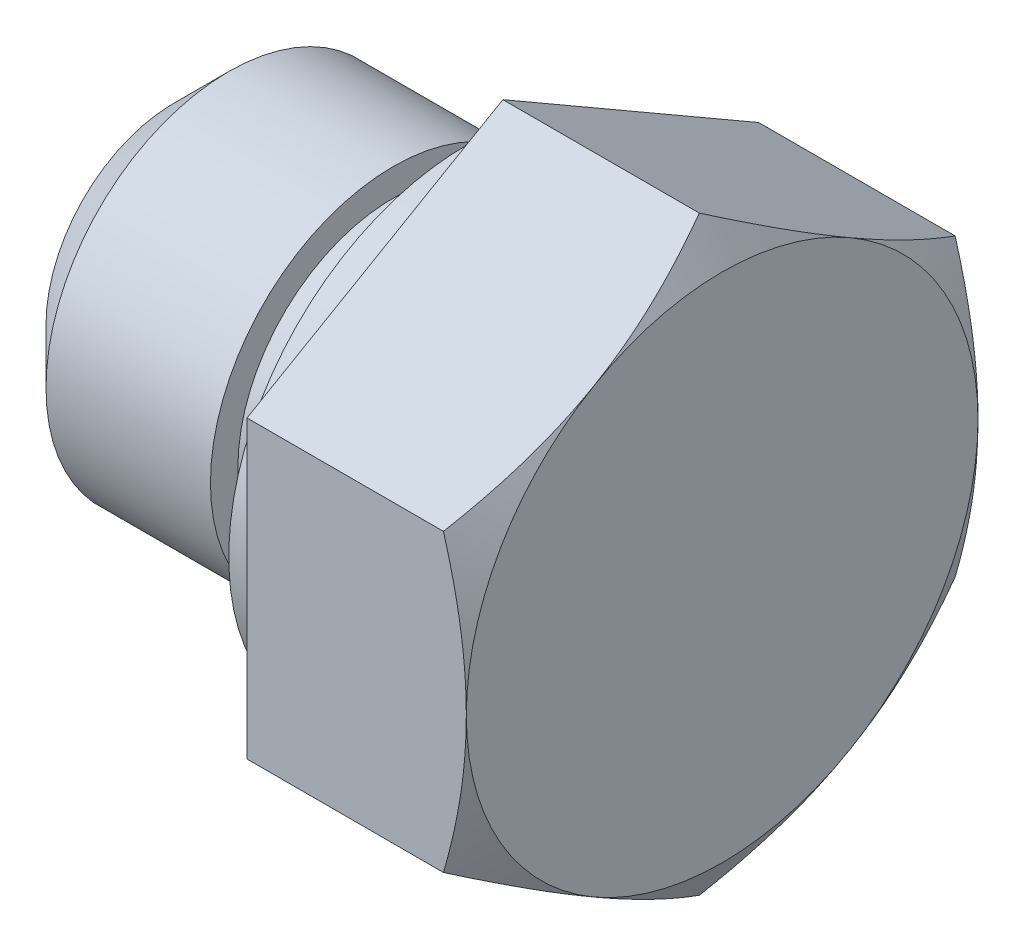
ISO-10303-21;
HEADER;
FILE_DESCRIPTION(('STEP AP214'),'2;1');
FILE_NAME('part.step','',(''),(''),'','','');
FILE_SCHEMA(('AUTOMOTIVE_DESIGN { 1 0 10303 214 1 1 1 1 }'));
ENDSEC;
DATA;
#1=APPLICATION_CONTEXT('core data for automotive mechanical design processes');
#2=APPLICATION_PROTOCOL_DEFINITION('international standard','automotive_design',2000,#1);
#3=PRODUCT_CONTEXT('',#1,'mechanical');
#4=PRODUCT('Part','Part','',(#3));
#5=PRODUCT_RELATED_PRODUCT_CATEGORY('part','',(#4));
#6=PRODUCT_DEFINITION_FORMATION('','',#4);
#7=PRODUCT_DEFINITION_CONTEXT('part definition',#1,'design');
#8=PRODUCT_DEFINITION('design','',#6,#7);
#9=PRODUCT_DEFINITION_SHAPE('','',#8);
#10=(LENGTH_UNIT() NAMED_UNIT(*) SI_UNIT(.MILLI.,.METRE.));
#11=(NAMED_UNIT(*) PLANE_ANGLE_UNIT() SI_UNIT($,.RADIAN.));
#12=(NAMED_UNIT(*) SI_UNIT($,.STERADIAN.) SOLID_ANGLE_UNIT());
#13=UNCERTAINTY_MEASURE_WITH_UNIT(LENGTH_MEASURE(1.E-05),#10,'distance_accuracy_value','');
#14=(GEOMETRIC_REPRESENTATION_CONTEXT(3) GLOBAL_UNCERTAINTY_ASSIGNED_CONTEXT((#13)) GLOBAL_UNIT_ASSIGNED_CONTEXT((#10,
#11,#12)) REPRESENTATION_CONTEXT('',''));
#15=CARTESIAN_POINT('',(0.,0.,0.));
#16=DIRECTION('',(0.,0.,1.));
#17=DIRECTION('',(1.,0.,0.));
#18=AXIS2_PLACEMENT_3D('',#15,#16,#17);
#19=CARTESIAN_POINT('',(-6.,8.08290376865473,0.));
#20=DIRECTION('',(0.,0.86602540378444,0.499999999999998));
#21=DIRECTION('',(0.,-0.499999999999998,0.86602540378444));
#22=AXIS2_PLACEMENT_3D('',#19,#20,#21);
#23=PLANE('',#22);
#24=CARTESIAN_POINT('',(-0.62528145043448,8.08301923870857,-0.000200000000000037));
#25=CARTESIAN_POINT('',(-0.573999847053467,7.99418356332249,0.153667903293392));
#26=CARTESIAN_POINT('',(-0.525045594003568,7.90501666556986,0.30810950055425));
#27=CARTESIAN_POINT('',(-0.432432787270118,7.72595873929903,0.618246926353253));
#28=CARTESIAN_POINT('',(-0.388776518079346,7.63606741609893,0.773943265295414));
#29=CARTESIAN_POINT('',(-0.26661159217948,7.36495417725223,1.24352516958246));
#30=CARTESIAN_POINT('',(-0.197125556894938,7.18266208641079,1.5592643327378));
#31=CARTESIAN_POINT('',(-0.115644956399085,6.90986528970959,2.03176224476632));
#32=CARTESIAN_POINT('',(-0.0924334848814621,6.82017566928257,2.18710922425748));
#33=CARTESIAN_POINT('',(-0.0535112144324508,6.64039116946079,2.49850511236216));
#34=CARTESIAN_POINT('',(-0.037799752779519,6.55029632658302,2.6545539577264));
#35=CARTESIAN_POINT('',(-0.0142779132830506,6.3699501664105,2.96692267009517));
#36=CARTESIAN_POINT('',(-0.00645856866285571,6.27969914366235,3.12324202693));
#37=CARTESIAN_POINT('',(0.00111975822770119,6.09911871281641,3.43601650800787));
#38=CARTESIAN_POINT('',(0.000878989506020932,6.00878930722636,3.59247162790733));
#39=CARTESIAN_POINT('',(-0.0108597318155942,5.7613166335591,4.02110687218393));
#40=CARTESIAN_POINT('',(-0.0305657427429098,5.60425437562032,4.29314668288539));
#41=CARTESIAN_POINT('',(-0.0930534601257633,5.29117305327855,4.83541944008219));
#42=CARTESIAN_POINT('',(-0.135856524112979,5.13515508991673,5.10565047951828));
#43=CARTESIAN_POINT('',(-0.242851679710355,4.82144370220968,5.64901454193983));
#44=CARTESIAN_POINT('',(-0.307497094569662,4.66378986193159,5.92207900330984));
#45=CARTESIAN_POINT('',(-0.454216071847031,4.35083323311212,6.46413578499063));
#46=CARTESIAN_POINT('',(-0.536255171025556,4.19552643669177,6.73313504715144));
#47=CARTESIAN_POINT('',(-0.625281450434493,4.04133641427354,7.0002));
#48=B_SPLINE_CURVE_WITH_KNOTS('',3,(#24,#25,#26,#27,#28,#29,#30,#31,#32,#33,#34,#35,#36,#37,#38,
#39,#40,#41,#42,#43,#44,#45,#46,#47),.UNSPECIFIED.,.F.,.F.,(4,2,2,2,2,2,2,2,2,2,2,4),(0.,
0.554727910214693,1.10969417576209,2.22193274027189,2.76443041023616,3.30688013473356,
3.84871284867108,4.39052882332377,5.33376515141417,6.27787517570455,7.24292418883238,
8.20607866430096),.UNSPECIFIED.);
#49=CARTESIAN_POINT('',(-0.625214782339262,8.08290376865473,0.));
#50=VERTEX_POINT('',#49);
#51=CARTESIAN_POINT('',(0.,6.06217782649108,3.49999999999999));
#52=VERTEX_POINT('',#51);
#53=EDGE_CURVE('E241',#50,#52,#48,.T.);
#54=ORIENTED_EDGE('',*,*,#53,.F.);
#55=DIRECTION('',(1.,0.,0.));
#56=VECTOR('',#55,1.);
#57=CARTESIAN_POINT('',(-6.,8.08290376865473,0.));
#58=LINE('',#57,#56);
#59=CARTESIAN_POINT('',(-6.,8.08290376865473,0.));
#60=VERTEX_POINT('',#59);
#61=EDGE_CURVE('E148',#60,#50,#58,.T.);
#62=ORIENTED_EDGE('',*,*,#61,.F.);
#63=DIRECTION('',(0.,-0.499999999999998,0.86602540378444));
#64=VECTOR('',#63,1.);
#65=CARTESIAN_POINT('',(-6.,8.08290376865473,0.));
#66=LINE('',#65,#64);
#67=CARTESIAN_POINT('',(-6.,4.04145188432738,7.));
#68=VERTEX_POINT('',#67);
#69=EDGE_CURVE('E325',#60,#68,#66,.T.);
#70=ORIENTED_EDGE('',*,*,#69,.T.);
#71=DIRECTION('',(1.,0.,0.));
#72=VECTOR('',#71,1.);
#73=CARTESIAN_POINT('',(-6.,4.04145188432738,7.));
#74=LINE('',#73,#72);
#75=CARTESIAN_POINT('',(-0.625214782339276,4.04145188432738,7.));
#76=VERTEX_POINT('',#75);
#77=EDGE_CURVE('E271',#68,#76,#74,.T.);
#78=ORIENTED_EDGE('',*,*,#77,.T.);
#79=EDGE_CURVE('E207',#52,#76,#48,.T.);
#80=ORIENTED_EDGE('',*,*,#79,.F.);
#81=EDGE_LOOP('',(#54,#62,#70,#78,#80));
#82=FACE_BOUND('',#81,.T.);
#83=ADVANCED_FACE('F49',(#82),#23,.T.);
#84=CARTESIAN_POINT('',(-6.,8.08290376865473,0.));
#85=DIRECTION('',(0.,0.86602540378444,-0.499999999999998));
#86=DIRECTION('',(0.,0.499999999999998,0.86602540378444));
#87=AXIS2_PLACEMENT_3D('',#84,#85,#86);
#88=PLANE('',#87);
#89=CARTESIAN_POINT('',(-0.625281450434494,4.04133641427354,-7.0002));
#90=CARTESIAN_POINT('',(-0.57399984705348,4.13017208965962,-6.84633209670661));
#91=CARTESIAN_POINT('',(-0.52504559400358,4.21933898741225,-6.69189049944575));
#92=CARTESIAN_POINT('',(-0.432432787270129,4.39839691368308,-6.38175307364675));
#93=CARTESIAN_POINT('',(-0.388776518079356,4.48828823688318,-6.22605673470458));
#94=CARTESIAN_POINT('',(-0.266611592179489,4.75940147572988,-5.75647483041754));
#95=CARTESIAN_POINT('',(-0.197125556894946,4.94169356657132,-5.4407356672622));
#96=CARTESIAN_POINT('',(-0.115644956399091,5.21449036327253,-4.96823775523367));
#97=CARTESIAN_POINT('',(-0.0924334848814674,5.30417998369954,-4.81289077574251));
#98=CARTESIAN_POINT('',(-0.0535112144324548,5.48396448352132,-4.50149488763784));
#99=CARTESIAN_POINT('',(-0.0377997527795224,5.5740593263991,-4.34544604227359));
#100=CARTESIAN_POINT('',(-0.0142779132830528,5.75440548657162,-4.03307732990483));
#101=CARTESIAN_POINT('',(-0.00645856866285735,5.84465650931976,-3.87675797306999));
#102=CARTESIAN_POINT('',(0.00111975822770057,6.02523694016571,-3.56398349199213));
#103=CARTESIAN_POINT('',(0.000878989506020807,6.11556634575576,-3.40752837209266));
#104=CARTESIAN_POINT('',(-0.0108597318155929,6.36303901942301,-2.97889312781607));
#105=CARTESIAN_POINT('',(-0.0305657427429074,6.5201012773618,-2.7068533171146));
#106=CARTESIAN_POINT('',(-0.0930534601257584,6.83318259970356,-2.16458055991781));
#107=CARTESIAN_POINT('',(-0.135856524112973,6.98920056306538,-1.89434952048172));
#108=CARTESIAN_POINT('',(-0.242851679710346,7.30291195077243,-1.35098545806017));
#109=CARTESIAN_POINT('',(-0.307497094569652,7.46056579105052,-1.07792099669016));
#110=CARTESIAN_POINT('',(-0.45421607184702,7.77352241986999,-0.535864215009371));
#111=CARTESIAN_POINT('',(-0.536255171025544,7.92882921629034,-0.26686495284856));
#112=CARTESIAN_POINT('',(-0.62528145043448,8.08301923870857,0.000199999999999549));
#113=B_SPLINE_CURVE_WITH_KNOTS('',3,(#89,#90,#91,#92,#93,#94,#95,#96,#97,#98,#99,#100,#101,#102,
#103,#104,#105,#106,#107,#108,#109,#110,#111,#112),.UNSPECIFIED.,.F.,.F.,(4,2,2,2,2,2,2,2,2,2,2,
4),(0.,0.554727910214693,1.10969417576209,2.2219327402719,2.76443041023617,3.30688013473357,
3.84871284867109,4.39052882332378,5.33376515141418,6.27787517570455,7.24292418883239,
8.20607866430096),.UNSPECIFIED.);
#114=CARTESIAN_POINT('',(-0.625214782339275,4.04145188432738,-7.));
#115=VERTEX_POINT('',#114);
#116=CARTESIAN_POINT('',(0.,6.06217782649108,-3.49999999999999));
#117=VERTEX_POINT('',#116);
#118=EDGE_CURVE('E142',#115,#117,#113,.T.);
#119=ORIENTED_EDGE('',*,*,#118,.F.);
#120=DIRECTION('',(1.,0.,0.));
#121=VECTOR('',#120,1.);
#122=CARTESIAN_POINT('',(-6.,4.04145188432738,-7.));
#123=LINE('',#122,#121);
#124=CARTESIAN_POINT('',(-6.,4.04145188432738,-7.));
#125=VERTEX_POINT('',#124);
#126=EDGE_CURVE('E157',#125,#115,#123,.T.);
#127=ORIENTED_EDGE('',*,*,#126,.F.);
#128=DIRECTION('',(0.,0.499999999999998,0.86602540378444));
#129=VECTOR('',#128,1.);
#130=CARTESIAN_POINT('',(-6.,8.08290376865473,0.));
#131=LINE('',#130,#129);
#132=EDGE_CURVE('E251',#125,#60,#131,.T.);
#133=ORIENTED_EDGE('',*,*,#132,.T.);
#134=ORIENTED_EDGE('',*,*,#61,.T.);
#135=EDGE_CURVE('E170',#117,#50,#113,.T.);
#136=ORIENTED_EDGE('',*,*,#135,.F.);
#137=EDGE_LOOP('',(#119,#127,#133,#134,#136));
#138=FACE_BOUND('',#137,.T.);
#139=ADVANCED_FACE('F233',(#138),#88,.T.);
#140=CARTESIAN_POINT('',(-6.,4.04145188432738,-7.));
#141=DIRECTION('',(0.,0.,-1.));
#142=DIRECTION('',(-1.,0.,0.));
#143=AXIS2_PLACEMENT_3D('',#140,#141,#142);
#144=PLANE('',#143);
#145=CARTESIAN_POINT('',(-3.40647718411653,-10.8358175614818,-7.));
#146=CARTESIAN_POINT('',(-3.25833232592636,-10.5302545485942,-7.));
#147=CARTESIAN_POINT('',(-3.111613720942,-10.22398795681,-7.));
#148=CARTESIAN_POINT('',(-2.8218315559376,-9.60967337631041,-7.));
#149=CARTESIAN_POINT('',(-2.67876857590034,-9.30162511431575,-7.));
#150=CARTESIAN_POINT('',(-2.39637614188585,-8.68177612024009,-7.));
#151=CARTESIAN_POINT('',(-2.25707143091345,-8.369964076357,-7.));
#152=CARTESIAN_POINT('',(-1.98418944123837,-7.74385304690142,-7.));
#153=CARTESIAN_POINT('',(-1.85061189059808,-7.42955418024978,-7.));
#154=CARTESIAN_POINT('',(-1.5865489113585,-6.78788985792206,-7.));
#155=CARTESIAN_POINT('',(-1.45629797244,-6.46042736430258,-7.));
#156=CARTESIAN_POINT('',(-1.20570248792891,-5.80166465463294,-7.));
#157=CARTESIAN_POINT('',(-1.08535905701311,-5.47036401152937,-7.));
#158=CARTESIAN_POINT('',(-0.857752966677389,-4.80402056190686,-7.));
#159=CARTESIAN_POINT('',(-0.750463650885666,-4.46898695982013,-7.));
#160=CARTESIAN_POINT('',(-0.552420339868015,-3.79412598937883,-7.));
#161=CARTESIAN_POINT('',(-0.461661115004447,-3.45430017392697,-7.));
#162=CARTESIAN_POINT('',(-0.301536117966153,-2.77149411096548,-7.));
#163=CARTESIAN_POINT('',(-0.232054703144718,-2.42854173774751,-7.));
#164=CARTESIAN_POINT('',(-0.146807505198832,-1.91100613781136,-7.));
#165=CARTESIAN_POINT('',(-0.121553095797278,-1.73796353772253,-7.));
#166=CARTESIAN_POINT('',(-0.0778650636704582,-1.39102504773377,-7.));
#167=CARTESIAN_POINT('',(-0.0594307828007719,-1.21712924181031,-7.));
#168=CARTESIAN_POINT('',(-0.0299803976593833,-0.870979918063503,-7.));
#169=CARTESIAN_POINT('',(-0.0188711794294456,-0.698734353184645,-7.));
#170=CARTESIAN_POINT('',(-0.0039452094440766,-0.353927898728433,-7.));
#171=CARTESIAN_POINT('',(-0.000128337398342371,-0.181367014399407,-7.));
#172=CARTESIAN_POINT('',(0.000121946393858136,0.163761692880148,-7.));
#173=CARTESIAN_POINT('',(-0.00344466509431518,0.336329515850802,-7.));
#174=CARTESIAN_POINT('',(-0.0178745205028026,0.681162045989254,-7.));
#175=CARTESIAN_POINT('',(-0.0287381329546606,0.853426737406946,-7.));
#176=CARTESIAN_POINT('',(-0.0634383247106036,1.26805025785209,-7.));
#177=CARTESIAN_POINT('',(-0.0907714800226244,1.510122562681,-7.));
#178=CARTESIAN_POINT('',(-0.158351025934006,1.99244585805923,-7.));
#179=CARTESIAN_POINT('',(-0.198599189902024,2.23269659384754,-7.));
#180=CARTESIAN_POINT('',(-0.336579908016218,2.95045642573076,-7.));
#181=CARTESIAN_POINT('',(-0.451522772534744,3.42469944208484,-7.));
#182=CARTESIAN_POINT('',(-0.650530681178876,4.13376993160629,-7.));
#183=CARTESIAN_POINT('',(-0.722214608399906,4.37228357513026,-7.));
#184=CARTESIAN_POINT('',(-0.872950919031528,4.84699383147595,-7.));
#185=CARTESIAN_POINT('',(-0.952003350296226,5.08319042923882,-7.));
#186=CARTESIAN_POINT('',(-1.11621474174076,5.553342141651,-7.));
#187=CARTESIAN_POINT('',(-1.20137163469723,5.78729798497222,-7.));
#188=CARTESIAN_POINT('',(-1.37679770503713,6.25327673008516,-7.));
#189=CARTESIAN_POINT('',(-1.46706682796128,6.48529965243761,-7.));
#190=CARTESIAN_POINT('',(-1.68245779004258,7.02415714408479,-7.));
#191=CARTESIAN_POINT('',(-1.80922552668017,7.33033251498721,-7.));
#192=CARTESIAN_POINT('',(-2.0687439690465,7.94014448268288,-7.));
#193=CARTESIAN_POINT('',(-2.20149501258295,8.24378093498271,-7.));
#194=CARTESIAN_POINT('',(-2.47180399778318,8.84896980958857,-7.));
#195=CARTESIAN_POINT('',(-2.60936284290799,9.15052182730572,-7.));
#196=CARTESIAN_POINT('',(-2.88834600983433,9.75183563193705,-7.));
#197=CARTESIAN_POINT('',(-3.0297704106953,10.0515973820831,-7.));
#198=CARTESIAN_POINT('',(-3.31591619771848,10.6499161094925,-7.));
#199=CARTESIAN_POINT('',(-3.4606407974656,10.9484715473446,-7.));
#200=CARTESIAN_POINT('',(-3.75269710193324,11.54430568228,-7.));
#201=CARTESIAN_POINT('',(-3.90002882942621,11.841584368183,-7.));
#202=CARTESIAN_POINT('',(-4.34521692262862,12.7317300689053,-7.));
#203=CARTESIAN_POINT('',(-4.64630246567392,13.322981950543,-7.));
#204=CARTESIAN_POINT('',(-5.22977516914347,14.4542671873634,-7.));
#205=CARTESIAN_POINT('',(-5.51168611592301,14.9945472434059,-7.));
#206=CARTESIAN_POINT('',(-6.07939885473634,16.0730805827809,-7.));
#207=CARTESIAN_POINT('',(-6.36520077518348,16.6113337984698,-7.));
#208=CARTESIAN_POINT('',(-6.93908880001351,17.684965085016,-7.));
#209=CARTESIAN_POINT('',(-7.22716781213951,18.2203469529571,-7.));
#210=CARTESIAN_POINT('',(-7.80566492511165,19.2898093080473,-7.));
#211=CARTESIAN_POINT('',(-8.09608290102679,19.8238898627446,-7.));
#212=CARTESIAN_POINT('',(-8.38737690869703,20.3574889291127,-7.));
#213=B_SPLINE_CURVE_WITH_KNOTS('',3,(#145,#146,#147,#148,#149,#150,#151,#152,#153,#154,#155,
#156,#157,#158,#159,#160,#161,#162,#163,#164,#165,#166,#167,#168,#169,#170,#171,#172,#173,#174,
#175,#176,#177,#178,#179,#180,#181,#182,#183,#184,#185,#186,#187,#188,#189,#190,#191,#192,#193,
#194,#195,#196,#197,#198,#199,#200,#201,#202,#203,#204,#205,#206,#207,#208,#209,#210,#211,#212),
.UNSPECIFIED.,.F.,.F.,(4,2,2,2,2,2,2,2,2,2,2,2,2,2,2,2,2,2,2,2,2,2,2,2,2,2,2,2,2,2,2,2,2,4),(0.,
1.018757293027,2.03767522574771,3.06217433841088,4.08662475170767,5.14374817644501,
6.20099037425493,7.25603611173218,8.31074748156437,9.35962048565461,9.88413446093951,
10.4085978072602,10.9262587703404,11.4439111943126,11.9615652472565,12.4792454460368,
13.209663902144,13.9401826954563,15.402041371645,16.1491386849674,16.8962408505862,
17.6430912009049,18.3899335967139,19.3839921065503,20.3781068097794,21.3724093378441,
22.3667322169071,23.3620685775059,24.3574136363543,26.347853251912,28.1760558969848,
30.0043190249841,31.8282123395925,33.6520088723316),.UNSPECIFIED.);
#214=CARTESIAN_POINT('',(-0.625214782339276,-4.04145188432738,-7.));
#215=VERTEX_POINT('',#214);
#216=CARTESIAN_POINT('',(0.,0.,-7.));
#217=VERTEX_POINT('',#216);
#218=EDGE_CURVE('E121',#215,#217,#213,.T.);
#219=ORIENTED_EDGE('',*,*,#218,.F.);
#220=DIRECTION('',(1.,0.,0.));
#221=VECTOR('',#220,1.);
#222=CARTESIAN_POINT('',(-6.,-4.04145188432738,-7.));
#223=LINE('',#222,#221);
#224=CARTESIAN_POINT('',(-6.,-4.04145188432738,-7.));
#225=VERTEX_POINT('',#224);
#226=EDGE_CURVE('E256',#225,#215,#223,.T.);
#227=ORIENTED_EDGE('',*,*,#226,.F.);
#228=DIRECTION('',(0.,1.,0.));
#229=VECTOR('',#228,1.);
#230=CARTESIAN_POINT('',(-6.,4.04145188432738,-7.));
#231=LINE('',#230,#229);
#232=EDGE_CURVE('E347',#225,#125,#231,.T.);
#233=ORIENTED_EDGE('',*,*,#232,.T.);
#234=ORIENTED_EDGE('',*,*,#126,.T.);
#235=EDGE_CURVE('E134',#217,#115,#213,.T.);
#236=ORIENTED_EDGE('',*,*,#235,.F.);
#237=EDGE_LOOP('',(#219,#227,#233,#234,#236));
#238=FACE_BOUND('',#237,.T.);
#239=ADVANCED_FACE('F155',(#238),#144,.T.);
#240=CARTESIAN_POINT('',(-6.,-4.04145188432738,-7.));
#241=DIRECTION('',(0.,-0.86602540378444,-0.499999999999998));
#242=DIRECTION('',(0.,0.499999999999998,-0.86602540378444));
#243=AXIS2_PLACEMENT_3D('',#240,#241,#242);
#244=PLANE('',#243);
#245=CARTESIAN_POINT('',(-0.62528145043448,-8.08301923870857,0.0002));
#246=CARTESIAN_POINT('',(-0.573999847053467,-7.99418356332249,-0.153667903293392));
#247=CARTESIAN_POINT('',(-0.525045594003568,-7.90501666556986,-0.30810950055425));
#248=CARTESIAN_POINT('',(-0.432432787270118,-7.72595873929903,-0.618246926353253));
#249=CARTESIAN_POINT('',(-0.388776518079346,-7.63606741609893,-0.773943265295414));
#250=CARTESIAN_POINT('',(-0.26661159217948,-7.36495417725223,-1.24352516958246));
#251=CARTESIAN_POINT('',(-0.197125556894938,-7.18266208641079,-1.5592643327378));
#252=CARTESIAN_POINT('',(-0.115644956399085,-6.90986528970959,-2.03176224476633));
#253=CARTESIAN_POINT('',(-0.092433484881462,-6.82017566928257,-2.18710922425748));
#254=CARTESIAN_POINT('',(-0.0535112144324507,-6.64039116946079,-2.49850511236216));
#255=CARTESIAN_POINT('',(-0.037799752779519,-6.55029632658302,-2.6545539577264));
#256=CARTESIAN_POINT('',(-0.0142779132830507,-6.3699501664105,-2.96692267009517));
#257=CARTESIAN_POINT('',(-0.00645856866285586,-6.27969914366236,-3.12324202693));
#258=CARTESIAN_POINT('',(0.00111975822770083,-6.09911871281641,-3.43601650800787));
#259=CARTESIAN_POINT('',(0.000878989506020452,-6.00878930722636,-3.59247162790733));
#260=CARTESIAN_POINT('',(-0.0108597318155948,-5.7613166335591,-4.02110687218393));
#261=CARTESIAN_POINT('',(-0.0305657427429101,-5.60425437562032,-4.29314668288539));
#262=CARTESIAN_POINT('',(-0.0930534601257633,-5.29117305327855,-4.83541944008219));
#263=CARTESIAN_POINT('',(-0.135856524112979,-5.13515508991673,-5.10565047951827));
#264=CARTESIAN_POINT('',(-0.242851679710355,-4.82144370220968,-5.64901454193983));
#265=CARTESIAN_POINT('',(-0.307497094569662,-4.66378986193159,-5.92207900330984));
#266=CARTESIAN_POINT('',(-0.454216071847032,-4.35083323311212,-6.46413578499063));
#267=CARTESIAN_POINT('',(-0.536255171025556,-4.19552643669177,-6.73313504715144));
#268=CARTESIAN_POINT('',(-0.625281450434493,-4.04133641427354,-7.0002));
#269=B_SPLINE_CURVE_WITH_KNOTS('',3,(#245,#246,#247,#248,#249,#250,#251,#252,#253,#254,#255,
#256,#257,#258,#259,#260,#261,#262,#263,#264,#265,#266,#267,#268),.UNSPECIFIED.,.F.,.F.,(4,2,2,
2,2,2,2,2,2,2,2,4),(0.,0.554727910214691,1.10969417576209,2.22193274027189,2.76443041023616,
3.30688013473356,3.84871284867108,4.39052882332377,5.33376515141417,6.27787517570455,
7.24292418883238,8.20607866430096),.UNSPECIFIED.);
#270=CARTESIAN_POINT('',(-0.625214782339262,-8.08290376865473,0.));
#271=VERTEX_POINT('',#270);
#272=CARTESIAN_POINT('',(0.,-6.06217782649108,-3.49999999999999));
#273=VERTEX_POINT('',#272);
#274=EDGE_CURVE('E65',#271,#273,#269,.T.);
#275=ORIENTED_EDGE('',*,*,#274,.F.);
#276=DIRECTION('',(1.,0.,0.));
#277=VECTOR('',#276,1.);
#278=CARTESIAN_POINT('',(-6.,-8.08290376865473,0.));
#279=LINE('',#278,#277);
#280=CARTESIAN_POINT('',(-6.,-8.08290376865473,0.));
#281=VERTEX_POINT('',#280);
#282=EDGE_CURVE('E263',#281,#271,#279,.T.);
#283=ORIENTED_EDGE('',*,*,#282,.F.);
#284=DIRECTION('',(0.,0.499999999999998,-0.86602540378444));
#285=VECTOR('',#284,1.);
#286=CARTESIAN_POINT('',(-6.,-4.04145188432738,-7.));
#287=LINE('',#286,#285);
#288=EDGE_CURVE('E344',#281,#225,#287,.T.);
#289=ORIENTED_EDGE('',*,*,#288,.T.);
#290=ORIENTED_EDGE('',*,*,#226,.T.);
#291=EDGE_CURVE('E128',#273,#215,#269,.T.);
#292=ORIENTED_EDGE('',*,*,#291,.F.);
#293=EDGE_LOOP('',(#275,#283,#289,#290,#292));
#294=FACE_BOUND('',#293,.T.);
#295=ADVANCED_FACE('F218',(#294),#244,.T.);
#296=CARTESIAN_POINT('',(-6.,-4.04145188432738,7.));
#297=DIRECTION('',(0.,-0.86602540378444,0.499999999999998));
#298=DIRECTION('',(0.,-0.499999999999998,-0.86602540378444));
#299=AXIS2_PLACEMENT_3D('',#296,#297,#298);
#300=PLANE('',#299);
#301=CARTESIAN_POINT('',(-0.625281450434494,-4.04133641427354,7.0002));
#302=CARTESIAN_POINT('',(-0.57399984705348,-4.13017208965962,6.84633209670661));
#303=CARTESIAN_POINT('',(-0.52504559400358,-4.21933898741225,6.69189049944575));
#304=CARTESIAN_POINT('',(-0.432432787270129,-4.39839691368308,6.38175307364674));
#305=CARTESIAN_POINT('',(-0.388776518079356,-4.48828823688318,6.22605673470458));
#306=CARTESIAN_POINT('',(-0.266611592179489,-4.75940147572988,5.75647483041753));
#307=CARTESIAN_POINT('',(-0.197125556894946,-4.94169356657132,5.4407356672622));
#308=CARTESIAN_POINT('',(-0.115644956399091,-5.21449036327253,4.96823775523367));
#309=CARTESIAN_POINT('',(-0.0924334848814675,-5.30417998369954,4.81289077574251));
#310=CARTESIAN_POINT('',(-0.0535112144324547,-5.48396448352132,4.50149488763784));
#311=CARTESIAN_POINT('',(-0.037799752779522,-5.5740593263991,4.34544604227359));
#312=CARTESIAN_POINT('',(-0.0142779132830524,-5.75440548657162,4.03307732990483));
#313=CARTESIAN_POINT('',(-0.00645856866285739,-5.84465650931976,3.87675797306999));
#314=CARTESIAN_POINT('',(0.00111975822770036,-6.02523694016571,3.56398349199213));
#315=CARTESIAN_POINT('',(0.000878989506020792,-6.11556634575576,3.40752837209266));
#316=CARTESIAN_POINT('',(-0.0108597318155926,-6.36303901942301,2.97889312781607));
#317=CARTESIAN_POINT('',(-0.030565742742907,-6.5201012773618,2.7068533171146));
#318=CARTESIAN_POINT('',(-0.0930534601257582,-6.83318259970356,2.16458055991781));
#319=CARTESIAN_POINT('',(-0.135856524112973,-6.98920056306538,1.89434952048172));
#320=CARTESIAN_POINT('',(-0.242851679710346,-7.30291195077243,1.35098545806017));
#321=CARTESIAN_POINT('',(-0.307497094569652,-7.46056579105052,1.07792099669016));
#322=CARTESIAN_POINT('',(-0.45421607184702,-7.77352241986999,0.535864215009371));
#323=CARTESIAN_POINT('',(-0.536255171025543,-7.92882921629034,0.26686495284856));
#324=CARTESIAN_POINT('',(-0.62528145043448,-8.08301923870857,-0.000200000000000001));
#325=B_SPLINE_CURVE_WITH_KNOTS('',3,(#301,#302,#303,#304,#305,#306,#307,#308,#309,#310,#311,
#312,#313,#314,#315,#316,#317,#318,#319,#320,#321,#322,#323,#324),.UNSPECIFIED.,.F.,.F.,(4,2,2,
2,2,2,2,2,2,2,2,4),(0.,0.554727910214694,1.10969417576209,2.2219327402719,2.76443041023617,
3.30688013473357,3.84871284867109,4.39052882332378,5.33376515141418,6.27787517570455,
7.24292418883239,8.20607866430096),.UNSPECIFIED.);
#326=CARTESIAN_POINT('',(-0.625214782339275,-4.04145188432738,7.));
#327=VERTEX_POINT('',#326);
#328=CARTESIAN_POINT('',(0.,-6.06217782649108,3.49999999999999));
#329=VERTEX_POINT('',#328);
#330=EDGE_CURVE('E73',#327,#329,#325,.T.);
#331=ORIENTED_EDGE('',*,*,#330,.F.);
#332=DIRECTION('',(1.,0.,0.));
#333=VECTOR('',#332,1.);
#334=CARTESIAN_POINT('',(-6.,-4.04145188432738,7.));
#335=LINE('',#334,#333);
#336=CARTESIAN_POINT('',(-6.,-4.04145188432738,7.));
#337=VERTEX_POINT('',#336);
#338=EDGE_CURVE('E267',#337,#327,#335,.T.);
#339=ORIENTED_EDGE('',*,*,#338,.F.);
#340=DIRECTION('',(0.,-0.499999999999998,-0.86602540378444));
#341=VECTOR('',#340,1.);
#342=CARTESIAN_POINT('',(-6.,-4.04145188432738,7.));
#343=LINE('',#342,#341);
#344=EDGE_CURVE('E335',#337,#281,#343,.T.);
#345=ORIENTED_EDGE('',*,*,#344,.T.);
#346=ORIENTED_EDGE('',*,*,#282,.T.);
#347=EDGE_CURVE('E217',#329,#271,#325,.T.);
#348=ORIENTED_EDGE('',*,*,#347,.F.);
#349=EDGE_LOOP('',(#331,#339,#345,#346,#348));
#350=FACE_BOUND('',#349,.T.);
#351=ADVANCED_FACE('F221',(#350),#300,.T.);
#352=CARTESIAN_POINT('',(-6.,4.04145188432738,7.));
#353=DIRECTION('',(0.,0.,1.));
#354=DIRECTION('',(1.,0.,0.));
#355=AXIS2_PLACEMENT_3D('',#352,#353,#354);
#356=PLANE('',#355);
#357=CARTESIAN_POINT('',(-3.40647718411653,-10.8358175614818,7.));
#358=CARTESIAN_POINT('',(-3.25833232592636,-10.5302545485942,7.));
#359=CARTESIAN_POINT('',(-3.111613720942,-10.22398795681,7.));
#360=CARTESIAN_POINT('',(-2.8218315559376,-9.60967337631041,7.));
#361=CARTESIAN_POINT('',(-2.67876857590034,-9.30162511431575,7.));
#362=CARTESIAN_POINT('',(-2.39637614188585,-8.68177612024009,7.));
#363=CARTESIAN_POINT('',(-2.25707143091345,-8.369964076357,7.));
#364=CARTESIAN_POINT('',(-1.98418944123837,-7.74385304690142,7.));
#365=CARTESIAN_POINT('',(-1.85061189059808,-7.42955418024978,7.));
#366=CARTESIAN_POINT('',(-1.5865489113585,-6.78788985792206,7.));
#367=CARTESIAN_POINT('',(-1.45629797244,-6.46042736430258,7.));
#368=CARTESIAN_POINT('',(-1.20570248792891,-5.80166465463294,7.));
#369=CARTESIAN_POINT('',(-1.08535905701311,-5.47036401152937,7.));
#370=CARTESIAN_POINT('',(-0.857752966677389,-4.80402056190686,7.));
#371=CARTESIAN_POINT('',(-0.750463650885666,-4.46898695982013,7.));
#372=CARTESIAN_POINT('',(-0.552420339868015,-3.79412598937883,7.));
#373=CARTESIAN_POINT('',(-0.461661115004447,-3.45430017392697,7.));
#374=CARTESIAN_POINT('',(-0.301536117966153,-2.77149411096548,7.));
#375=CARTESIAN_POINT('',(-0.232054703144718,-2.42854173774751,7.));
#376=CARTESIAN_POINT('',(-0.146807505198832,-1.91100613781136,7.));
#377=CARTESIAN_POINT('',(-0.121553095797278,-1.73796353772253,7.));
#378=CARTESIAN_POINT('',(-0.0778650636704582,-1.39102504773377,7.));
#379=CARTESIAN_POINT('',(-0.0594307828007719,-1.21712924181031,7.));
#380=CARTESIAN_POINT('',(-0.0299803976593833,-0.870979918063503,7.));
#381=CARTESIAN_POINT('',(-0.0188711794294456,-0.698734353184645,7.));
#382=CARTESIAN_POINT('',(-0.0039452094440766,-0.353927898728433,7.));
#383=CARTESIAN_POINT('',(-0.000128337398342371,-0.181367014399407,7.));
#384=CARTESIAN_POINT('',(0.000121946393858136,0.163761692880148,7.));
#385=CARTESIAN_POINT('',(-0.00344466509431518,0.336329515850802,7.));
#386=CARTESIAN_POINT('',(-0.0178745205028026,0.681162045989254,7.));
#387=CARTESIAN_POINT('',(-0.0287381329546606,0.853426737406946,7.));
#388=CARTESIAN_POINT('',(-0.0634383247106036,1.26805025785209,7.));
#389=CARTESIAN_POINT('',(-0.0907714800226244,1.510122562681,7.));
#390=CARTESIAN_POINT('',(-0.158351025934006,1.99244585805923,7.));
#391=CARTESIAN_POINT('',(-0.198599189902024,2.23269659384754,7.));
#392=CARTESIAN_POINT('',(-0.336579908016218,2.95045642573076,7.));
#393=CARTESIAN_POINT('',(-0.451522772534744,3.42469944208484,7.));
#394=CARTESIAN_POINT('',(-0.650530681178876,4.13376993160629,7.));
#395=CARTESIAN_POINT('',(-0.722214608399906,4.37228357513026,7.));
#396=CARTESIAN_POINT('',(-0.872950919031528,4.84699383147595,7.));
#397=CARTESIAN_POINT('',(-0.952003350296226,5.08319042923882,7.));
#398=CARTESIAN_POINT('',(-1.11621474174076,5.553342141651,7.));
#399=CARTESIAN_POINT('',(-1.20137163469723,5.78729798497222,7.));
#400=CARTESIAN_POINT('',(-1.37679770503713,6.25327673008516,7.));
#401=CARTESIAN_POINT('',(-1.46706682796128,6.48529965243761,7.));
#402=CARTESIAN_POINT('',(-1.68245779004258,7.02415714408479,7.));
#403=CARTESIAN_POINT('',(-1.80922552668017,7.33033251498721,7.));
#404=CARTESIAN_POINT('',(-2.0687439690465,7.94014448268288,7.));
#405=CARTESIAN_POINT('',(-2.20149501258295,8.24378093498271,7.));
#406=CARTESIAN_POINT('',(-2.47180399778318,8.84896980958857,7.));
#407=CARTESIAN_POINT('',(-2.60936284290799,9.15052182730572,7.));
#408=CARTESIAN_POINT('',(-2.88834600983433,9.75183563193705,7.));
#409=CARTESIAN_POINT('',(-3.0297704106953,10.0515973820831,7.));
#410=CARTESIAN_POINT('',(-3.31591619771848,10.6499161094925,7.));
#411=CARTESIAN_POINT('',(-3.4606407974656,10.9484715473446,7.));
#412=CARTESIAN_POINT('',(-3.75269710193324,11.54430568228,7.));
#413=CARTESIAN_POINT('',(-3.90002882942621,11.841584368183,7.));
#414=CARTESIAN_POINT('',(-4.34521692262862,12.7317300689053,7.));
#415=CARTESIAN_POINT('',(-4.64630246567392,13.322981950543,7.));
#416=CARTESIAN_POINT('',(-5.22977516914347,14.4542671873634,7.));
#417=CARTESIAN_POINT('',(-5.51168611592301,14.9945472434059,7.));
#418=CARTESIAN_POINT('',(-6.07939885473634,16.0730805827809,7.));
#419=CARTESIAN_POINT('',(-6.36520077518348,16.6113337984698,7.));
#420=CARTESIAN_POINT('',(-6.93908880001351,17.684965085016,7.));
#421=CARTESIAN_POINT('',(-7.22716781213951,18.2203469529571,7.));
#422=CARTESIAN_POINT('',(-7.80566492511165,19.2898093080473,7.));
#423=CARTESIAN_POINT('',(-8.09608290102679,19.8238898627446,7.));
#424=CARTESIAN_POINT('',(-8.38737690869703,20.3574889291127,7.));
#425=B_SPLINE_CURVE_WITH_KNOTS('',3,(#357,#358,#359,#360,#361,#362,#363,#364,#365,#366,#367,
#368,#369,#370,#371,#372,#373,#374,#375,#376,#377,#378,#379,#380,#381,#382,#383,#384,#385,#386,
#387,#388,#389,#390,#391,#392,#393,#394,#395,#396,#397,#398,#399,#400,#401,#402,#403,#404,#405,
#406,#407,#408,#409,#410,#411,#412,#413,#414,#415,#416,#417,#418,#419,#420,#421,#422,#423,#424),
.UNSPECIFIED.,.F.,.F.,(4,2,2,2,2,2,2,2,2,2,2,2,2,2,2,2,2,2,2,2,2,2,2,2,2,2,2,2,2,2,2,2,2,4),(0.,
1.018757293027,2.03767522574771,3.06217433841088,4.08662475170767,5.14374817644501,
6.20099037425493,7.25603611173218,8.31074748156437,9.35962048565461,9.88413446093951,
10.4085978072602,10.9262587703404,11.4439111943126,11.9615652472565,12.4792454460368,
13.209663902144,13.9401826954563,15.402041371645,16.1491386849674,16.8962408505862,
17.6430912009049,18.3899335967139,19.3839921065503,20.3781068097794,21.3724093378441,
22.3667322169071,23.3620685775059,24.3574136363543,26.347853251912,28.1760558969848,
30.0043190249841,31.8282123395925,33.6520088723316),.UNSPECIFIED.);
#426=CARTESIAN_POINT('',(0.,0.,7.));
#427=VERTEX_POINT('',#426);
#428=EDGE_CURVE('E362',#76,#427,#425,.F.);
#429=ORIENTED_EDGE('',*,*,#428,.F.);
#430=ORIENTED_EDGE('',*,*,#77,.F.);
#431=DIRECTION('',(0.,-1.,0.));
#432=VECTOR('',#431,1.);
#433=CARTESIAN_POINT('',(-6.,4.04145188432738,7.));
#434=LINE('',#433,#432);
#435=EDGE_CURVE('E329',#68,#337,#434,.T.);
#436=ORIENTED_EDGE('',*,*,#435,.T.);
#437=ORIENTED_EDGE('',*,*,#338,.T.);
#438=EDGE_CURVE('E190',#427,#327,#425,.F.);
#439=ORIENTED_EDGE('',*,*,#438,.F.);
#440=EDGE_LOOP('',(#429,#430,#436,#437,#439));
#441=FACE_BOUND('',#440,.T.);
#442=ADVANCED_FACE('F225',(#441),#356,.T.);
#443=CARTESIAN_POINT('',(-6.,0.,0.));
#444=DIRECTION('',(1.,0.,0.));
#445=DIRECTION('',(0.,0.,-1.));
#446=AXIS2_PLACEMENT_3D('',#443,#444,#445);
#447=PLANE('',#446);
#448=CARTESIAN_POINT('',(-6.,0.,0.));
#449=DIRECTION('',(1.,0.,0.));
#450=DIRECTION('',(0.,0.,-1.));
#451=AXIS2_PLACEMENT_3D('',#448,#449,#450);
#452=CIRCLE('',#451,6.5);
#453=CARTESIAN_POINT('',(-6.,0.,-6.5));
#454=VERTEX_POINT('',#453);
#455=EDGE_CURVE('E323',#454,#454,#452,.T.);
#456=ORIENTED_EDGE('',*,*,#455,.T.);
#457=EDGE_LOOP('',(#456));
#458=FACE_BOUND('',#457,.T.);
#459=ORIENTED_EDGE('',*,*,#69,.F.);
#460=ORIENTED_EDGE('',*,*,#132,.F.);
#461=ORIENTED_EDGE('',*,*,#232,.F.);
#462=ORIENTED_EDGE('',*,*,#288,.F.);
#463=ORIENTED_EDGE('',*,*,#344,.F.);
#464=ORIENTED_EDGE('',*,*,#435,.F.);
#465=EDGE_LOOP('',(#459,#460,#461,#462,#463,#464));
#466=FACE_BOUND('',#465,.T.);
#467=ADVANCED_FACE('F229',(#458,#466),#447,.F.);
#468=CARTESIAN_POINT('',(10.6118859087781,0.,0.));
#469=DIRECTION('',(1.,0.,0.));
#470=DIRECTION('',(0.,0.,-1.));
#471=AXIS2_PLACEMENT_3D('',#468,#469,#470);
#472=CYLINDRICAL_SURFACE('',#471,6.5);
#473=CARTESIAN_POINT('',(-7.,0.,0.));
#474=DIRECTION('',(1.,0.,0.));
#475=DIRECTION('',(0.,0.,-1.));
#476=AXIS2_PLACEMENT_3D('',#473,#474,#475);
#477=CIRCLE('',#476,6.5);
#478=CARTESIAN_POINT('',(-7.,0.,-6.5));
#479=VERTEX_POINT('',#478);
#480=EDGE_CURVE('E337',#479,#479,#477,.T.);
#481=ORIENTED_EDGE('',*,*,#480,.T.);
#482=EDGE_LOOP('',(#481));
#483=FACE_BOUND('',#482,.T.);
#484=ORIENTED_EDGE('',*,*,#455,.F.);
#485=EDGE_LOOP('',(#484));
#486=FACE_BOUND('',#485,.T.);
#487=ADVANCED_FACE('F310',(#483,#486),#472,.T.);
#488=CARTESIAN_POINT('',(-7.,6.5,0.));
#489=DIRECTION('',(-1.,0.,0.));
#490=DIRECTION('',(0.,0.,1.));
#491=AXIS2_PLACEMENT_3D('',#488,#489,#490);
#492=PLANE('',#491);
#493=CARTESIAN_POINT('',(-7.,0.,0.));
#494=DIRECTION('',(1.,0.,0.));
#495=DIRECTION('',(0.,0.,-1.));
#496=AXIS2_PLACEMENT_3D('',#493,#494,#495);
#497=CIRCLE('',#496,4.25);
#498=CARTESIAN_POINT('',(-7.,0.,-4.25));
#499=VERTEX_POINT('',#498);
#500=EDGE_CURVE('E525',#499,#499,#497,.T.);
#501=ORIENTED_EDGE('',*,*,#500,.T.);
#502=EDGE_LOOP('',(#501));
#503=FACE_BOUND('',#502,.T.);
#504=ORIENTED_EDGE('',*,*,#480,.F.);
#505=EDGE_LOOP('',(#504));
#506=FACE_BOUND('',#505,.T.);
#507=ADVANCED_FACE('F306',(#503,#506),#492,.T.);
#508=CARTESIAN_POINT('',(10.6118859087781,0.,0.));
#509=DIRECTION('',(1.,0.,0.));
#510=DIRECTION('',(0.,0.,-1.));
#511=AXIS2_PLACEMENT_3D('',#508,#509,#510);
#512=CYLINDRICAL_SURFACE('',#511,4.25);
#513=CARTESIAN_POINT('',(-9.,0.,0.));
#514=DIRECTION('',(1.,0.,0.));
#515=DIRECTION('',(0.,0.,-1.));
#516=AXIS2_PLACEMENT_3D('',#513,#514,#515);
#517=CIRCLE('',#516,4.25);
#518=CARTESIAN_POINT('',(-9.,0.,-4.25));
#519=VERTEX_POINT('',#518);
#520=EDGE_CURVE('E528',#519,#519,#517,.T.);
#521=ORIENTED_EDGE('',*,*,#520,.T.);
#522=EDGE_LOOP('',(#521));
#523=FACE_BOUND('',#522,.T.);
#524=ORIENTED_EDGE('',*,*,#500,.F.);
#525=EDGE_LOOP('',(#524));
#526=FACE_BOUND('',#525,.T.);
#527=ADVANCED_FACE('F300',(#523,#526),#512,.T.);
#528=CARTESIAN_POINT('',(-9.,4.25,0.));
#529=DIRECTION('',(1.,0.,0.));
#530=DIRECTION('',(0.,0.,-1.));
#531=AXIS2_PLACEMENT_3D('',#528,#529,#530);
#532=PLANE('',#531);
#533=CARTESIAN_POINT('',(-9.,0.,0.));
#534=DIRECTION('',(1.,0.,0.));
#535=DIRECTION('',(0.,0.,-1.));
#536=AXIS2_PLACEMENT_3D('',#533,#534,#535);
#537=CIRCLE('',#536,5.);
#538=CARTESIAN_POINT('',(-9.,0.,-5.));
#539=VERTEX_POINT('',#538);
#540=EDGE_CURVE('E133',#539,#539,#537,.T.);
#541=ORIENTED_EDGE('',*,*,#540,.T.);
#542=EDGE_LOOP('',(#541));
#543=FACE_BOUND('',#542,.T.);
#544=ORIENTED_EDGE('',*,*,#520,.F.);
#545=EDGE_LOOP('',(#544));
#546=FACE_BOUND('',#545,.T.);
#547=ADVANCED_FACE('F296',(#543,#546),#532,.T.);
#548=CARTESIAN_POINT('',(10.6118859087781,0.,0.));
#549=DIRECTION('',(1.,0.,0.));
#550=DIRECTION('',(0.,0.,-1.));
#551=AXIS2_PLACEMENT_3D('',#548,#549,#550);
#552=CYLINDRICAL_SURFACE('',#551,5.);
#553=CARTESIAN_POINT('',(-13.5,0.,0.));
#554=DIRECTION('',(-1.,0.,0.));
#555=DIRECTION('',(0.,0.,1.));
#556=AXIS2_PLACEMENT_3D('',#553,#554,#555);
#557=CIRCLE('',#556,5.);
#558=CARTESIAN_POINT('',(-13.5,0.,5.));
#559=VERTEX_POINT('',#558);
#560=EDGE_CURVE('E58',#559,#559,#557,.F.);
#561=ORIENTED_EDGE('',*,*,#560,.T.);
#562=EDGE_LOOP('',(#561));
#563=FACE_BOUND('',#562,.T.);
#564=ORIENTED_EDGE('',*,*,#540,.F.);
#565=EDGE_LOOP('',(#564));
#566=FACE_BOUND('',#565,.T.);
#567=ADVANCED_FACE('F278',(#563,#566),#552,.T.);
#568=CARTESIAN_POINT('',(-15.,5.,0.));
#569=DIRECTION('',(-1.,0.,0.));
#570=DIRECTION('',(0.,0.,1.));
#571=AXIS2_PLACEMENT_3D('',#568,#569,#570);
#572=PLANE('',#571);
#573=CARTESIAN_POINT('',(-15.,0.,0.));
#574=DIRECTION('',(-1.,0.,0.));
#575=DIRECTION('',(0.,0.,1.));
#576=AXIS2_PLACEMENT_3D('',#573,#574,#575);
#577=CIRCLE('',#576,3.49999999999999);
#578=CARTESIAN_POINT('',(-15.,0.,3.49999999999999));
#579=VERTEX_POINT('',#578);
#580=EDGE_CURVE('E11',#579,#579,#577,.T.);
#581=ORIENTED_EDGE('',*,*,#580,.T.);
#582=EDGE_LOOP('',(#581));
#583=FACE_BOUND('',#582,.T.);
#584=ADVANCED_FACE('F185',(#583),#572,.T.);
#585=CARTESIAN_POINT('',(0.,0.,0.));
#586=DIRECTION('',(-1.,0.,0.));
#587=DIRECTION('',(0.,0.,1.));
#588=AXIS2_PLACEMENT_3D('',#585,#586,#587);
#589=CONICAL_SURFACE('',#588,7.,1.0471975511966);
#590=ORIENTED_EDGE('',*,*,#235,.T.);
#591=ORIENTED_EDGE('',*,*,#118,.T.);
#592=CARTESIAN_POINT('',(0.,0.,0.));
#593=DIRECTION('',(1.,0.,0.));
#594=DIRECTION('',(0.,0.,-1.));
#595=AXIS2_PLACEMENT_3D('',#592,#593,#594);
#596=CIRCLE('',#595,7.);
#597=EDGE_CURVE('E139',#117,#217,#596,.F.);
#598=ORIENTED_EDGE('',*,*,#597,.T.);
#599=EDGE_LOOP('',(#590,#591,#598));
#600=FACE_BOUND('',#599,.T.);
#601=ADVANCED_FACE('F140',(#600),#589,.T.);
#602=ORIENTED_EDGE('',*,*,#135,.T.);
#603=ORIENTED_EDGE('',*,*,#53,.T.);
#604=EDGE_CURVE('E147',#52,#117,#596,.F.);
#605=ORIENTED_EDGE('',*,*,#604,.T.);
#606=EDGE_LOOP('',(#602,#603,#605));
#607=FACE_BOUND('',#606,.T.);
#608=ADVANCED_FACE('F294',(#607),#589,.T.);
#609=ORIENTED_EDGE('',*,*,#79,.T.);
#610=ORIENTED_EDGE('',*,*,#428,.T.);
#611=CARTESIAN_POINT('',(0.,0.,0.));
#612=DIRECTION('',(-1.,0.,0.));
#613=DIRECTION('',(0.,0.,1.));
#614=AXIS2_PLACEMENT_3D('',#611,#612,#613);
#615=CIRCLE('',#614,7.);
#616=EDGE_CURVE('E368',#427,#52,#615,.T.);
#617=ORIENTED_EDGE('',*,*,#616,.T.);
#618=EDGE_LOOP('',(#609,#610,#617));
#619=FACE_BOUND('',#618,.T.);
#620=ADVANCED_FACE('F184',(#619),#589,.T.);
#621=ORIENTED_EDGE('',*,*,#330,.T.);
#622=EDGE_CURVE('E373',#329,#427,#596,.F.);
#623=ORIENTED_EDGE('',*,*,#622,.T.);
#624=ORIENTED_EDGE('',*,*,#438,.T.);
#625=EDGE_LOOP('',(#621,#623,#624));
#626=FACE_BOUND('',#625,.T.);
#627=ADVANCED_FACE('F179',(#626),#589,.T.);
#628=ORIENTED_EDGE('',*,*,#274,.T.);
#629=EDGE_CURVE('E152',#273,#329,#596,.F.);
#630=ORIENTED_EDGE('',*,*,#629,.T.);
#631=ORIENTED_EDGE('',*,*,#347,.T.);
#632=EDGE_LOOP('',(#628,#630,#631));
#633=FACE_BOUND('',#632,.T.);
#634=ADVANCED_FACE('F183',(#633),#589,.T.);
#635=ORIENTED_EDGE('',*,*,#218,.T.);
#636=EDGE_CURVE('E125',#217,#273,#596,.F.);
#637=ORIENTED_EDGE('',*,*,#636,.T.);
#638=ORIENTED_EDGE('',*,*,#291,.T.);
#639=EDGE_LOOP('',(#635,#637,#638));
#640=FACE_BOUND('',#639,.T.);
#641=ADVANCED_FACE('F123',(#640),#589,.T.);
#642=CARTESIAN_POINT('',(0.,0.,0.));
#643=DIRECTION('',(1.,0.,0.));
#644=DIRECTION('',(0.,0.,-1.));
#645=AXIS2_PLACEMENT_3D('',#642,#643,#644);
#646=PLANE('',#645);
#647=ORIENTED_EDGE('',*,*,#636,.F.);
#648=ORIENTED_EDGE('',*,*,#597,.F.);
#649=ORIENTED_EDGE('',*,*,#604,.F.);
#650=ORIENTED_EDGE('',*,*,#616,.F.);
#651=ORIENTED_EDGE('',*,*,#622,.F.);
#652=ORIENTED_EDGE('',*,*,#629,.F.);
#653=EDGE_LOOP('',(#647,#648,#649,#650,#651,#652));
#654=FACE_BOUND('',#653,.T.);
#655=ADVANCED_FACE('F150',(#654),#646,.T.);
#656=CARTESIAN_POINT('',(-13.5,0.,0.));
#657=DIRECTION('',(1.,0.,0.));
#658=DIRECTION('',(0.,0.,-1.));
#659=AXIS2_PLACEMENT_3D('',#656,#657,#658);
#660=CONICAL_SURFACE('',#659,5.,0.785398163397451);
#661=ORIENTED_EDGE('',*,*,#580,.F.);
#662=EDGE_LOOP('',(#661));
#663=FACE_BOUND('',#662,.T.);
#664=ORIENTED_EDGE('',*,*,#560,.F.);
#665=EDGE_LOOP('',(#664));
#666=FACE_BOUND('',#665,.T.);
#667=ADVANCED_FACE('F51',(#663,#666),#660,.T.);
#668=CLOSED_SHELL('',(#83,#139,#239,#295,#351,#442,#467,#487,#507,#527,#547,#567,#584,#601,#608,
#620,#627,#634,#641,#655,#667));
#669=MANIFOLD_SOLID_BREP('B2',#668);
#670=ADVANCED_BREP_SHAPE_REPRESENTATION('',(#18,#669),#14);
#671=SHAPE_DEFINITION_REPRESENTATION(#9,#670);
ENDSEC;
END-ISO-10303-21;
